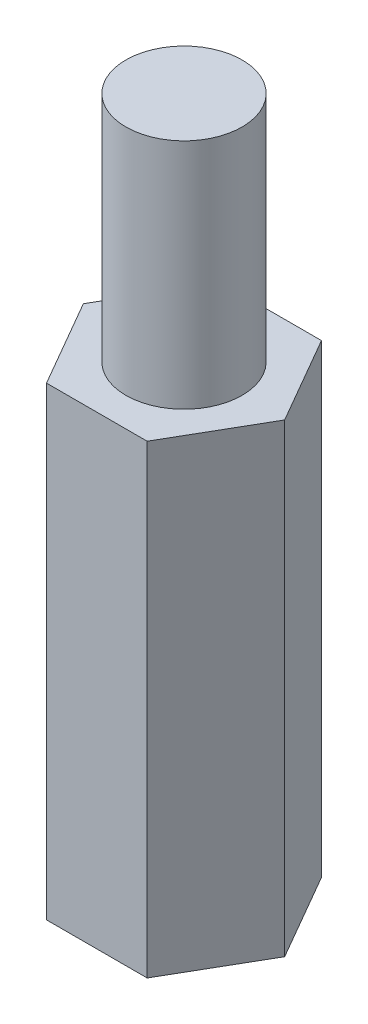
ISO-10303-21;
HEADER;
FILE_DESCRIPTION(('STEP AP214'),'2;1');
FILE_NAME('part.step','',(''),(''),'','','');
FILE_SCHEMA(('AUTOMOTIVE_DESIGN { 1 0 10303 214 1 1 1 1 }'));
ENDSEC;
DATA;
#1=APPLICATION_CONTEXT('core data for automotive mechanical design processes');
#2=APPLICATION_PROTOCOL_DEFINITION('international standard','automotive_design',2000,#1);
#3=PRODUCT_CONTEXT('',#1,'mechanical');
#4=PRODUCT('Part','Part','',(#3));
#5=PRODUCT_RELATED_PRODUCT_CATEGORY('part','',(#4));
#6=PRODUCT_DEFINITION_FORMATION('','',#4);
#7=PRODUCT_DEFINITION_CONTEXT('part definition',#1,'design');
#8=PRODUCT_DEFINITION('design','',#6,#7);
#9=PRODUCT_DEFINITION_SHAPE('','',#8);
#10=(LENGTH_UNIT() NAMED_UNIT(*) SI_UNIT(.MILLI.,.METRE.));
#11=(NAMED_UNIT(*) PLANE_ANGLE_UNIT() SI_UNIT($,.RADIAN.));
#12=(NAMED_UNIT(*) SI_UNIT($,.STERADIAN.) SOLID_ANGLE_UNIT());
#13=UNCERTAINTY_MEASURE_WITH_UNIT(LENGTH_MEASURE(1.E-05),#10,'distance_accuracy_value','');
#14=(GEOMETRIC_REPRESENTATION_CONTEXT(3) GLOBAL_UNCERTAINTY_ASSIGNED_CONTEXT((#13)) GLOBAL_UNIT_ASSIGNED_CONTEXT((#10,
#11,#12)) REPRESENTATION_CONTEXT('',''));
#15=CARTESIAN_POINT('',(0.,0.,0.));
#16=DIRECTION('',(0.,0.,1.));
#17=DIRECTION('',(1.,0.,0.));
#18=AXIS2_PLACEMENT_3D('',#15,#16,#17);
#19=CARTESIAN_POINT('',(0.,12.,0.));
#20=DIRECTION('',(0.,1.,0.));
#21=DIRECTION('',(0.,0.,1.));
#22=AXIS2_PLACEMENT_3D('',#19,#20,#21);
#23=PLANE('',#22);
#24=DIRECTION('',(0.5,0.,-0.866025403784439));
#25=VECTOR('',#24,1.);
#26=CARTESIAN_POINT('',(1.29903810567665,12.,2.25000000000001));
#27=LINE('',#26,#25);
#28=CARTESIAN_POINT('',(1.29903810567665,12.,2.25000000000001));
#29=VERTEX_POINT('',#28);
#30=CARTESIAN_POINT('',(2.59807621135331,12.,0.));
#31=VERTEX_POINT('',#30);
#32=EDGE_CURVE('E130',#29,#31,#27,.T.);
#33=ORIENTED_EDGE('',*,*,#32,.T.);
#34=DIRECTION('',(-0.499999999999999,0.,-0.866025403784439));
#35=VECTOR('',#34,1.);
#36=CARTESIAN_POINT('',(2.59807621135331,12.,0.));
#37=LINE('',#36,#35);
#38=CARTESIAN_POINT('',(1.29903810567665,12.,-2.25000000000001));
#39=VERTEX_POINT('',#38);
#40=EDGE_CURVE('E85',#31,#39,#37,.T.);
#41=ORIENTED_EDGE('',*,*,#40,.T.);
#42=DIRECTION('',(-1.,0.,0.));
#43=VECTOR('',#42,1.);
#44=CARTESIAN_POINT('',(1.29903810567665,12.,-2.25000000000001));
#45=LINE('',#44,#43);
#46=CARTESIAN_POINT('',(-1.29903810567666,12.,-2.25000000000001));
#47=VERTEX_POINT('',#46);
#48=EDGE_CURVE('E98',#39,#47,#45,.T.);
#49=ORIENTED_EDGE('',*,*,#48,.T.);
#50=DIRECTION('',(-0.5,0.,0.866025403784438));
#51=VECTOR('',#50,1.);
#52=CARTESIAN_POINT('',(-1.29903810567666,12.,-2.25000000000001));
#53=LINE('',#52,#51);
#54=CARTESIAN_POINT('',(-2.59807621135332,12.,0.));
#55=VERTEX_POINT('',#54);
#56=EDGE_CURVE('E92',#47,#55,#53,.T.);
#57=ORIENTED_EDGE('',*,*,#56,.T.);
#58=DIRECTION('',(0.500000000000001,0.,0.866025403784438));
#59=VECTOR('',#58,1.);
#60=CARTESIAN_POINT('',(-2.59807621135332,12.,0.));
#61=LINE('',#60,#59);
#62=CARTESIAN_POINT('',(-1.29903810567666,12.,2.25000000000001));
#63=VERTEX_POINT('',#62);
#64=EDGE_CURVE('E96',#55,#63,#61,.T.);
#65=ORIENTED_EDGE('',*,*,#64,.T.);
#66=DIRECTION('',(1.,0.,0.));
#67=VECTOR('',#66,1.);
#68=CARTESIAN_POINT('',(-1.29903810567666,12.,2.25000000000001));
#69=LINE('',#68,#67);
#70=EDGE_CURVE('E50',#63,#29,#69,.T.);
#71=ORIENTED_EDGE('',*,*,#70,.T.);
#72=EDGE_LOOP('',(#33,#41,#49,#57,#65,#71));
#73=FACE_BOUND('',#72,.T.);
#74=CARTESIAN_POINT('',(0.,12.,0.));
#75=DIRECTION('',(0.,1.,0.));
#76=DIRECTION('',(0.,0.,1.));
#77=AXIS2_PLACEMENT_3D('',#74,#75,#76);
#78=CIRCLE('',#77,1.5);
#79=CARTESIAN_POINT('',(0.,12.,1.5));
#80=VERTEX_POINT('',#79);
#81=EDGE_CURVE('E151',#80,#80,#78,.T.);
#82=ORIENTED_EDGE('',*,*,#81,.F.);
#83=EDGE_LOOP('',(#82));
#84=FACE_BOUND('',#83,.T.);
#85=ADVANCED_FACE('F32',(#73,#84),#23,.T.);
#86=CARTESIAN_POINT('',(0.,12.,0.));
#87=DIRECTION('',(0.,-1.,0.));
#88=DIRECTION('',(0.,0.,-1.));
#89=AXIS2_PLACEMENT_3D('',#86,#87,#88);
#90=CYLINDRICAL_SURFACE('',#89,1.5);
#91=CARTESIAN_POINT('',(0.,0.,0.));
#92=DIRECTION('',(0.,1.,0.));
#93=DIRECTION('',(0.,0.,1.));
#94=AXIS2_PLACEMENT_3D('',#91,#92,#93);
#95=CIRCLE('',#94,1.5);
#96=CARTESIAN_POINT('',(0.,0.,1.5));
#97=VERTEX_POINT('',#96);
#98=EDGE_CURVE('E119',#97,#97,#95,.T.);
#99=ORIENTED_EDGE('',*,*,#98,.F.);
#100=EDGE_LOOP('',(#99));
#101=FACE_BOUND('',#100,.T.);
#102=CARTESIAN_POINT('',(0.,9.,0.));
#103=DIRECTION('',(0.,1.,0.));
#104=DIRECTION('',(0.,0.,1.));
#105=AXIS2_PLACEMENT_3D('',#102,#103,#104);
#106=CIRCLE('',#105,1.5);
#107=CARTESIAN_POINT('',(0.,9.,1.5));
#108=VERTEX_POINT('',#107);
#109=EDGE_CURVE('E36',#108,#108,#106,.T.);
#110=ORIENTED_EDGE('',*,*,#109,.T.);
#111=EDGE_LOOP('',(#110));
#112=FACE_BOUND('',#111,.T.);
#113=ADVANCED_FACE('F161',(#101,#112),#90,.F.);
#114=CARTESIAN_POINT('',(0.,0.,0.));
#115=DIRECTION('',(0.,1.,0.));
#116=DIRECTION('',(0.,0.,1.));
#117=AXIS2_PLACEMENT_3D('',#114,#115,#116);
#118=PLANE('',#117);
#119=DIRECTION('',(0.5,0.,-0.866025403784439));
#120=VECTOR('',#119,1.);
#121=CARTESIAN_POINT('',(1.29903810567665,0.,2.25000000000001));
#122=LINE('',#121,#120);
#123=CARTESIAN_POINT('',(1.29903810567665,0.,2.25000000000001));
#124=VERTEX_POINT('',#123);
#125=CARTESIAN_POINT('',(2.59807621135331,0.,0.));
#126=VERTEX_POINT('',#125);
#127=EDGE_CURVE('E116',#124,#126,#122,.T.);
#128=ORIENTED_EDGE('',*,*,#127,.F.);
#129=DIRECTION('',(1.,0.,0.));
#130=VECTOR('',#129,1.);
#131=CARTESIAN_POINT('',(-1.29903810567666,0.,2.25000000000001));
#132=LINE('',#131,#130);
#133=CARTESIAN_POINT('',(-1.29903810567666,0.,2.25000000000001));
#134=VERTEX_POINT('',#133);
#135=EDGE_CURVE('E128',#134,#124,#132,.T.);
#136=ORIENTED_EDGE('',*,*,#135,.F.);
#137=DIRECTION('',(0.500000000000001,0.,0.866025403784438));
#138=VECTOR('',#137,1.);
#139=CARTESIAN_POINT('',(-2.59807621135332,0.,0.));
#140=LINE('',#139,#138);
#141=CARTESIAN_POINT('',(-2.59807621135332,0.,0.));
#142=VERTEX_POINT('',#141);
#143=EDGE_CURVE('E126',#142,#134,#140,.T.);
#144=ORIENTED_EDGE('',*,*,#143,.F.);
#145=DIRECTION('',(-0.5,0.,0.866025403784438));
#146=VECTOR('',#145,1.);
#147=CARTESIAN_POINT('',(-1.29903810567666,0.,-2.25000000000001));
#148=LINE('',#147,#146);
#149=CARTESIAN_POINT('',(-1.29903810567666,0.,-2.25000000000001));
#150=VERTEX_POINT('',#149);
#151=EDGE_CURVE('E106',#150,#142,#148,.T.);
#152=ORIENTED_EDGE('',*,*,#151,.F.);
#153=DIRECTION('',(-1.,0.,0.));
#154=VECTOR('',#153,1.);
#155=CARTESIAN_POINT('',(1.29903810567665,0.,-2.25000000000001));
#156=LINE('',#155,#154);
#157=CARTESIAN_POINT('',(1.29903810567665,0.,-2.25000000000001));
#158=VERTEX_POINT('',#157);
#159=EDGE_CURVE('E122',#158,#150,#156,.T.);
#160=ORIENTED_EDGE('',*,*,#159,.F.);
#161=DIRECTION('',(-0.499999999999999,0.,-0.866025403784439));
#162=VECTOR('',#161,1.);
#163=CARTESIAN_POINT('',(2.59807621135331,0.,0.));
#164=LINE('',#163,#162);
#165=EDGE_CURVE('E118',#126,#158,#164,.T.);
#166=ORIENTED_EDGE('',*,*,#165,.F.);
#167=EDGE_LOOP('',(#128,#136,#144,#152,#160,#166));
#168=FACE_BOUND('',#167,.T.);
#169=ORIENTED_EDGE('',*,*,#98,.T.);
#170=EDGE_LOOP('',(#169));
#171=FACE_BOUND('',#170,.T.);
#172=ADVANCED_FACE('F142',(#168,#171),#118,.F.);
#173=CARTESIAN_POINT('',(1.29903810567665,12.,2.25000000000001));
#174=DIRECTION('',(-0.866025403784439,0.,-0.5));
#175=DIRECTION('',(-0.5,0.,0.866025403784439));
#176=AXIS2_PLACEMENT_3D('',#173,#174,#175);
#177=PLANE('',#176);
#178=DIRECTION('',(0.,-1.,0.));
#179=VECTOR('',#178,1.);
#180=CARTESIAN_POINT('',(1.29903810567665,12.,2.25000000000001));
#181=LINE('',#180,#179);
#182=EDGE_CURVE('E78',#29,#124,#181,.T.);
#183=ORIENTED_EDGE('',*,*,#182,.T.);
#184=ORIENTED_EDGE('',*,*,#127,.T.);
#185=DIRECTION('',(0.,-1.,0.));
#186=VECTOR('',#185,1.);
#187=CARTESIAN_POINT('',(2.59807621135331,12.,0.));
#188=LINE('',#187,#186);
#189=EDGE_CURVE('E11',#31,#126,#188,.T.);
#190=ORIENTED_EDGE('',*,*,#189,.F.);
#191=ORIENTED_EDGE('',*,*,#32,.F.);
#192=EDGE_LOOP('',(#183,#184,#190,#191));
#193=FACE_BOUND('',#192,.T.);
#194=ADVANCED_FACE('F34',(#193),#177,.F.);
#195=CARTESIAN_POINT('',(2.59807621135331,12.,0.));
#196=DIRECTION('',(-0.866025403784439,0.,0.499999999999999));
#197=DIRECTION('',(0.499999999999999,0.,0.866025403784439));
#198=AXIS2_PLACEMENT_3D('',#195,#196,#197);
#199=PLANE('',#198);
#200=ORIENTED_EDGE('',*,*,#189,.T.);
#201=ORIENTED_EDGE('',*,*,#165,.T.);
#202=DIRECTION('',(0.,-1.,0.));
#203=VECTOR('',#202,1.);
#204=CARTESIAN_POINT('',(1.29903810567665,12.,-2.25000000000001));
#205=LINE('',#204,#203);
#206=EDGE_CURVE('E42',#39,#158,#205,.T.);
#207=ORIENTED_EDGE('',*,*,#206,.F.);
#208=ORIENTED_EDGE('',*,*,#40,.F.);
#209=EDGE_LOOP('',(#200,#201,#207,#208));
#210=FACE_BOUND('',#209,.T.);
#211=ADVANCED_FACE('F138',(#210),#199,.F.);
#212=CARTESIAN_POINT('',(1.29903810567665,12.,-2.25000000000001));
#213=DIRECTION('',(0.,0.,1.));
#214=DIRECTION('',(1.,0.,0.));
#215=AXIS2_PLACEMENT_3D('',#212,#213,#214);
#216=PLANE('',#215);
#217=ORIENTED_EDGE('',*,*,#206,.T.);
#218=ORIENTED_EDGE('',*,*,#159,.T.);
#219=DIRECTION('',(0.,-1.,0.));
#220=VECTOR('',#219,1.);
#221=CARTESIAN_POINT('',(-1.29903810567666,12.,-2.25000000000001));
#222=LINE('',#221,#220);
#223=EDGE_CURVE('E109',#47,#150,#222,.T.);
#224=ORIENTED_EDGE('',*,*,#223,.F.);
#225=ORIENTED_EDGE('',*,*,#48,.F.);
#226=EDGE_LOOP('',(#217,#218,#224,#225));
#227=FACE_BOUND('',#226,.T.);
#228=ADVANCED_FACE('F135',(#227),#216,.F.);
#229=CARTESIAN_POINT('',(-1.29903810567666,12.,-2.25000000000001));
#230=DIRECTION('',(0.866025403784438,0.,0.5));
#231=DIRECTION('',(0.5,0.,-0.866025403784439));
#232=AXIS2_PLACEMENT_3D('',#229,#230,#231);
#233=PLANE('',#232);
#234=ORIENTED_EDGE('',*,*,#223,.T.);
#235=ORIENTED_EDGE('',*,*,#151,.T.);
#236=DIRECTION('',(0.,-1.,0.));
#237=VECTOR('',#236,1.);
#238=CARTESIAN_POINT('',(-2.59807621135332,12.,0.));
#239=LINE('',#238,#237);
#240=EDGE_CURVE('E103',#55,#142,#239,.T.);
#241=ORIENTED_EDGE('',*,*,#240,.F.);
#242=ORIENTED_EDGE('',*,*,#56,.F.);
#243=EDGE_LOOP('',(#234,#235,#241,#242));
#244=FACE_BOUND('',#243,.T.);
#245=ADVANCED_FACE('F104',(#244),#233,.F.);
#246=CARTESIAN_POINT('',(-2.59807621135332,12.,0.));
#247=DIRECTION('',(0.866025403784438,0.,-0.500000000000001));
#248=DIRECTION('',(-0.500000000000001,0.,-0.866025403784438));
#249=AXIS2_PLACEMENT_3D('',#246,#247,#248);
#250=PLANE('',#249);
#251=ORIENTED_EDGE('',*,*,#240,.T.);
#252=ORIENTED_EDGE('',*,*,#143,.T.);
#253=DIRECTION('',(0.,-1.,0.));
#254=VECTOR('',#253,1.);
#255=CARTESIAN_POINT('',(-1.29903810567666,12.,2.25000000000001));
#256=LINE('',#255,#254);
#257=EDGE_CURVE('E71',#63,#134,#256,.T.);
#258=ORIENTED_EDGE('',*,*,#257,.F.);
#259=ORIENTED_EDGE('',*,*,#64,.F.);
#260=EDGE_LOOP('',(#251,#252,#258,#259));
#261=FACE_BOUND('',#260,.T.);
#262=ADVANCED_FACE('F111',(#261),#250,.F.);
#263=CARTESIAN_POINT('',(-1.29903810567666,12.,2.25000000000001));
#264=DIRECTION('',(0.,0.,-1.));
#265=DIRECTION('',(-1.,0.,0.));
#266=AXIS2_PLACEMENT_3D('',#263,#264,#265);
#267=PLANE('',#266);
#268=ORIENTED_EDGE('',*,*,#257,.T.);
#269=ORIENTED_EDGE('',*,*,#135,.T.);
#270=ORIENTED_EDGE('',*,*,#182,.F.);
#271=ORIENTED_EDGE('',*,*,#70,.F.);
#272=EDGE_LOOP('',(#268,#269,#270,#271));
#273=FACE_BOUND('',#272,.T.);
#274=ADVANCED_FACE('F145',(#273),#267,.F.);
#275=CARTESIAN_POINT('',(0.,9.,0.));
#276=DIRECTION('',(0.,1.,0.));
#277=DIRECTION('',(0.,0.,1.));
#278=AXIS2_PLACEMENT_3D('',#275,#276,#277);
#279=PLANE('',#278);
#280=ORIENTED_EDGE('',*,*,#109,.F.);
#281=EDGE_LOOP('',(#280));
#282=FACE_BOUND('',#281,.T.);
#283=ADVANCED_FACE('F163',(#282),#279,.F.);
#284=CARTESIAN_POINT('',(0.,18.,0.));
#285=DIRECTION('',(0.,-1.,0.));
#286=DIRECTION('',(0.,0.,-1.));
#287=AXIS2_PLACEMENT_3D('',#284,#285,#286);
#288=CYLINDRICAL_SURFACE('',#287,1.5);
#289=CARTESIAN_POINT('',(0.,18.,0.));
#290=DIRECTION('',(0.,1.,0.));
#291=DIRECTION('',(0.,0.,1.));
#292=AXIS2_PLACEMENT_3D('',#289,#290,#291);
#293=CIRCLE('',#292,1.5);
#294=CARTESIAN_POINT('',(0.,18.,1.5));
#295=VERTEX_POINT('',#294);
#296=EDGE_CURVE('E154',#295,#295,#293,.T.);
#297=ORIENTED_EDGE('',*,*,#296,.F.);
#298=EDGE_LOOP('',(#297));
#299=FACE_BOUND('',#298,.T.);
#300=ORIENTED_EDGE('',*,*,#81,.T.);
#301=EDGE_LOOP('',(#300));
#302=FACE_BOUND('',#301,.T.);
#303=ADVANCED_FACE('F165',(#299,#302),#288,.T.);
#304=CARTESIAN_POINT('',(0.,18.,0.));
#305=DIRECTION('',(0.,1.,0.));
#306=DIRECTION('',(0.,0.,1.));
#307=AXIS2_PLACEMENT_3D('',#304,#305,#306);
#308=PLANE('',#307);
#309=ORIENTED_EDGE('',*,*,#296,.T.);
#310=EDGE_LOOP('',(#309));
#311=FACE_BOUND('',#310,.T.);
#312=ADVANCED_FACE('F171',(#311),#308,.T.);
#313=CLOSED_SHELL('',(#85,#113,#172,#194,#211,#228,#245,#262,#274,#283,#303,#312));
#314=MANIFOLD_SOLID_BREP('B2',#313);
#315=ADVANCED_BREP_SHAPE_REPRESENTATION('',(#18,#314),#14);
#316=SHAPE_DEFINITION_REPRESENTATION(#9,#315);
ENDSEC;
END-ISO-10303-21;
